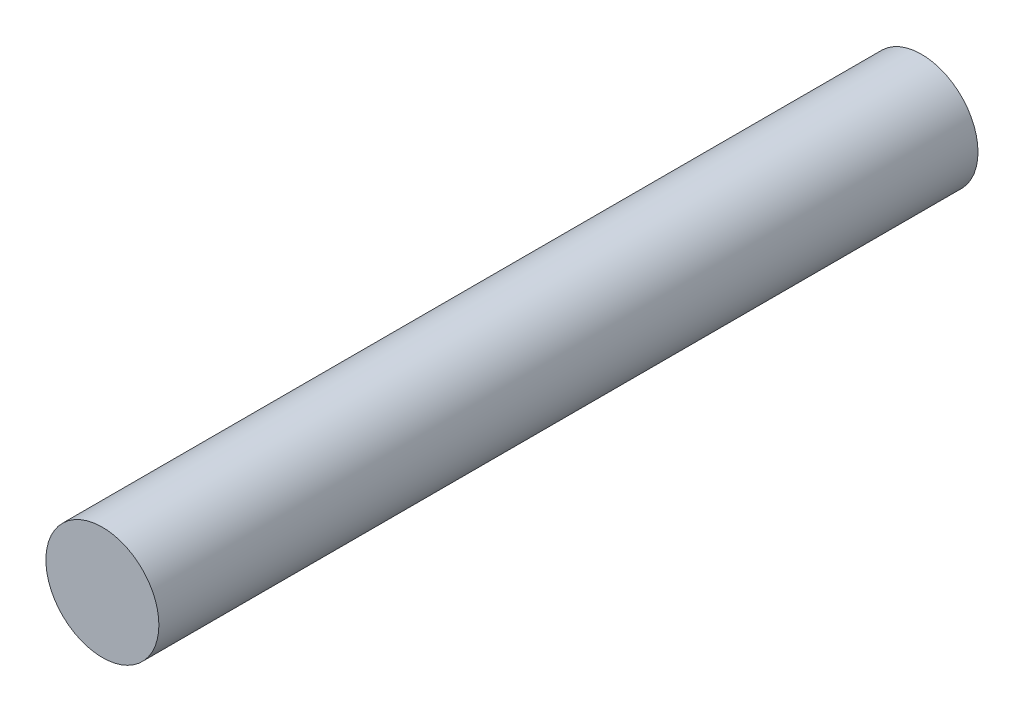
ISO-10303-21;
HEADER;
FILE_DESCRIPTION(('STEP AP214'),'2;1');
FILE_NAME('part.step','',(''),(''),'','','');
FILE_SCHEMA(('AUTOMOTIVE_DESIGN { 1 0 10303 214 1 1 1 1 }'));
ENDSEC;
DATA;
#1=APPLICATION_CONTEXT('core data for automotive mechanical design processes');
#2=APPLICATION_PROTOCOL_DEFINITION('international standard','automotive_design',2000,#1);
#3=PRODUCT_CONTEXT('',#1,'mechanical');
#4=PRODUCT('Part','Part','',(#3));
#5=PRODUCT_RELATED_PRODUCT_CATEGORY('part','',(#4));
#6=PRODUCT_DEFINITION_FORMATION('','',#4);
#7=PRODUCT_DEFINITION_CONTEXT('part definition',#1,'design');
#8=PRODUCT_DEFINITION('design','',#6,#7);
#9=PRODUCT_DEFINITION_SHAPE('','',#8);
#10=(LENGTH_UNIT() NAMED_UNIT(*) SI_UNIT(.MILLI.,.METRE.));
#11=(NAMED_UNIT(*) PLANE_ANGLE_UNIT() SI_UNIT($,.RADIAN.));
#12=(NAMED_UNIT(*) SI_UNIT($,.STERADIAN.) SOLID_ANGLE_UNIT());
#13=UNCERTAINTY_MEASURE_WITH_UNIT(LENGTH_MEASURE(1.E-05),#10,'distance_accuracy_value','');
#14=(GEOMETRIC_REPRESENTATION_CONTEXT(3) GLOBAL_UNCERTAINTY_ASSIGNED_CONTEXT((#13)) GLOBAL_UNIT_ASSIGNED_CONTEXT((#10,
#11,#12)) REPRESENTATION_CONTEXT('',''));
#15=CARTESIAN_POINT('',(0.,0.,0.));
#16=DIRECTION('',(0.,0.,1.));
#17=DIRECTION('',(1.,0.,0.));
#18=AXIS2_PLACEMENT_3D('',#15,#16,#17);
#19=CARTESIAN_POINT('',(0.,0.,72.5));
#20=DIRECTION('',(0.,0.,-1.));
#21=DIRECTION('',(-1.,0.,0.));
#22=AXIS2_PLACEMENT_3D('',#19,#20,#21);
#23=CYLINDRICAL_SURFACE('',#22,10.);
#24=CARTESIAN_POINT('',(0.,0.,72.5));
#25=DIRECTION('',(0.,0.,1.));
#26=DIRECTION('',(1.,0.,0.));
#27=AXIS2_PLACEMENT_3D('',#24,#25,#26);
#28=CIRCLE('',#27,10.);
#29=CARTESIAN_POINT('',(10.,0.,72.5));
#30=VERTEX_POINT('',#29);
#31=EDGE_CURVE('E10',#30,#30,#28,.T.);
#32=ORIENTED_EDGE('',*,*,#31,.F.);
#33=EDGE_LOOP('',(#32));
#34=FACE_BOUND('',#33,.T.);
#35=CARTESIAN_POINT('',(0.,0.,-72.5));
#36=DIRECTION('',(0.,0.,1.));
#37=DIRECTION('',(1.,0.,0.));
#38=AXIS2_PLACEMENT_3D('',#35,#36,#37);
#39=CIRCLE('',#38,10.);
#40=CARTESIAN_POINT('',(10.,0.,-72.5));
#41=VERTEX_POINT('',#40);
#42=EDGE_CURVE('E38',#41,#41,#39,.T.);
#43=ORIENTED_EDGE('',*,*,#42,.T.);
#44=EDGE_LOOP('',(#43));
#45=FACE_BOUND('',#44,.T.);
#46=ADVANCED_FACE('F35',(#34,#45),#23,.T.);
#47=CARTESIAN_POINT('',(0.,0.,72.5));
#48=DIRECTION('',(0.,0.,1.));
#49=DIRECTION('',(1.,0.,0.));
#50=AXIS2_PLACEMENT_3D('',#47,#48,#49);
#51=PLANE('',#50);
#52=ORIENTED_EDGE('',*,*,#31,.T.);
#53=EDGE_LOOP('',(#52));
#54=FACE_BOUND('',#53,.T.);
#55=ADVANCED_FACE('F50',(#54),#51,.T.);
#56=CARTESIAN_POINT('',(0.,0.,-72.5));
#57=DIRECTION('',(0.,0.,1.));
#58=DIRECTION('',(1.,0.,0.));
#59=AXIS2_PLACEMENT_3D('',#56,#57,#58);
#60=PLANE('',#59);
#61=ORIENTED_EDGE('',*,*,#42,.F.);
#62=EDGE_LOOP('',(#61));
#63=FACE_BOUND('',#62,.T.);
#64=ADVANCED_FACE('F48',(#63),#60,.F.);
#65=CLOSED_SHELL('',(#46,#55,#64));
#66=MANIFOLD_SOLID_BREP('B2',#65);
#67=ADVANCED_BREP_SHAPE_REPRESENTATION('',(#18,#66),#14);
#68=SHAPE_DEFINITION_REPRESENTATION(#9,#67);
ENDSEC;
END-ISO-10303-21;
